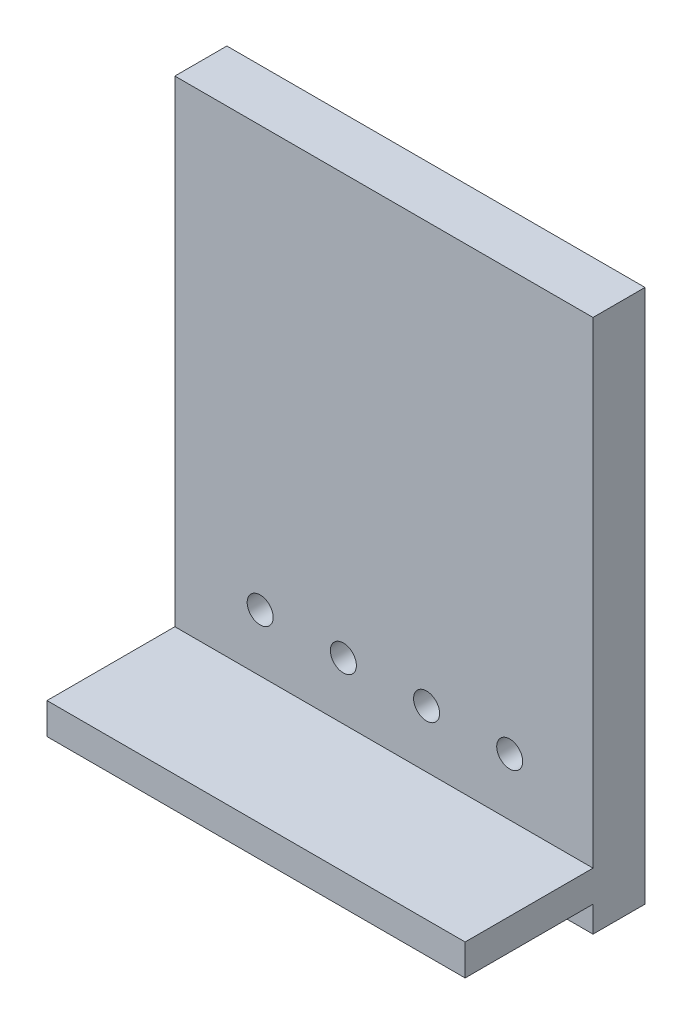
ISO-10303-21;
HEADER;
FILE_DESCRIPTION(('STEP AP214'),'2;1');
FILE_NAME('part.step','',(''),(''),'','','');
FILE_SCHEMA(('AUTOMOTIVE_DESIGN { 1 0 10303 214 1 1 1 1 }'));
ENDSEC;
DATA;
#1=APPLICATION_CONTEXT('core data for automotive mechanical design processes');
#2=APPLICATION_PROTOCOL_DEFINITION('international standard','automotive_design',2000,#1);
#3=PRODUCT_CONTEXT('',#1,'mechanical');
#4=PRODUCT('Part','Part','',(#3));
#5=PRODUCT_RELATED_PRODUCT_CATEGORY('part','',(#4));
#6=PRODUCT_DEFINITION_FORMATION('','',#4);
#7=PRODUCT_DEFINITION_CONTEXT('part definition',#1,'design');
#8=PRODUCT_DEFINITION('design','',#6,#7);
#9=PRODUCT_DEFINITION_SHAPE('','',#8);
#10=(LENGTH_UNIT() NAMED_UNIT(*) SI_UNIT(.MILLI.,.METRE.));
#11=(NAMED_UNIT(*) PLANE_ANGLE_UNIT() SI_UNIT($,.RADIAN.));
#12=(NAMED_UNIT(*) SI_UNIT($,.STERADIAN.) SOLID_ANGLE_UNIT());
#13=UNCERTAINTY_MEASURE_WITH_UNIT(LENGTH_MEASURE(1.E-05),#10,'distance_accuracy_value','');
#14=(GEOMETRIC_REPRESENTATION_CONTEXT(3) GLOBAL_UNCERTAINTY_ASSIGNED_CONTEXT((#13)) GLOBAL_UNIT_ASSIGNED_CONTEXT((#10,
#11,#12)) REPRESENTATION_CONTEXT('',''));
#15=CARTESIAN_POINT('',(0.,0.,0.));
#16=DIRECTION('',(0.,0.,1.));
#17=DIRECTION('',(1.,0.,0.));
#18=AXIS2_PLACEMENT_3D('',#15,#16,#17);
#19=CARTESIAN_POINT('',(0.,0.,5.));
#20=DIRECTION('',(0.,0.,1.));
#21=DIRECTION('',(1.,0.,0.));
#22=AXIS2_PLACEMENT_3D('',#19,#20,#21);
#23=PLANE('',#22);
#24=DIRECTION('',(1.,0.,0.));
#25=VECTOR('',#24,1.);
#26=CARTESIAN_POINT('',(0.,-1284.53054294,5.));
#27=LINE('',#26,#25);
#28=CARTESIAN_POINT('',(-53.4568763637691,-1284.53054294,5.));
#29=VERTEX_POINT('',#28);
#30=CARTESIAN_POINT('',(-13.256876363769,-1284.53054294,5.));
#31=VERTEX_POINT('',#30);
#32=EDGE_CURVE('E121',#29,#31,#27,.T.);
#33=ORIENTED_EDGE('',*,*,#32,.F.);
#34=DIRECTION('',(0.,-1.,0.));
#35=VECTOR('',#34,1.);
#36=CARTESIAN_POINT('',(-53.4568763637691,-1235.68054294037,5.));
#37=LINE('',#36,#35);
#38=CARTESIAN_POINT('',(-53.4568763637691,-1287.03054294037,5.));
#39=VERTEX_POINT('',#38);
#40=EDGE_CURVE('E138',#29,#39,#37,.T.);
#41=ORIENTED_EDGE('',*,*,#40,.T.);
#42=DIRECTION('',(1.,0.,0.));
#43=VECTOR('',#42,1.);
#44=CARTESIAN_POINT('',(-53.4568763637691,-1287.03054294037,5.));
#45=LINE('',#44,#43);
#46=CARTESIAN_POINT('',(-13.256876363769,-1287.03054294037,5.));
#47=VERTEX_POINT('',#46);
#48=EDGE_CURVE('E137',#39,#47,#45,.T.);
#49=ORIENTED_EDGE('',*,*,#48,.T.);
#50=DIRECTION('',(0.,-1.,0.));
#51=VECTOR('',#50,1.);
#52=CARTESIAN_POINT('',(-13.2568763637691,-1235.68054294037,5.));
#53=LINE('',#52,#51);
#54=EDGE_CURVE('E51',#31,#47,#53,.T.);
#55=ORIENTED_EDGE('',*,*,#54,.F.);
#56=EDGE_LOOP('',(#33,#41,#49,#55));
#57=FACE_BOUND('',#56,.T.);
#58=ADVANCED_FACE('F34',(#57),#23,.T.);
#59=CARTESIAN_POINT('',(-53.4568763637691,-1235.68054294037,5.));
#60=DIRECTION('',(1.,0.,0.));
#61=DIRECTION('',(0.,1.,0.));
#62=AXIS2_PLACEMENT_3D('',#59,#60,#61);
#63=PLANE('',#62);
#64=DIRECTION('',(0.,-1.,0.));
#65=VECTOR('',#64,1.);
#66=CARTESIAN_POINT('',(-53.4568763637691,-1235.68054294037,0.));
#67=LINE('',#66,#65);
#68=CARTESIAN_POINT('',(-53.4568763637691,-1235.68054294037,0.));
#69=VERTEX_POINT('',#68);
#70=CARTESIAN_POINT('',(-53.4568763637691,-1287.03054294037,0.));
#71=VERTEX_POINT('',#70);
#72=EDGE_CURVE('E126',#69,#71,#67,.T.);
#73=ORIENTED_EDGE('',*,*,#72,.T.);
#74=DIRECTION('',(0.,0.,-1.));
#75=VECTOR('',#74,1.);
#76=CARTESIAN_POINT('',(-53.4568763637691,-1287.03054294037,5.));
#77=LINE('',#76,#75);
#78=EDGE_CURVE('E11',#39,#71,#77,.T.);
#79=ORIENTED_EDGE('',*,*,#78,.F.);
#80=ORIENTED_EDGE('',*,*,#40,.F.);
#81=DIRECTION('',(0.,0.,-1.));
#82=VECTOR('',#81,1.);
#83=CARTESIAN_POINT('',(-53.4568763637691,-1284.53054294,17.295));
#84=LINE('',#83,#82);
#85=CARTESIAN_POINT('',(-53.4568763637691,-1284.53054294,17.295));
#86=VERTEX_POINT('',#85);
#87=EDGE_CURVE('E131',#86,#29,#84,.T.);
#88=ORIENTED_EDGE('',*,*,#87,.F.);
#89=DIRECTION('',(0.,-1.,0.));
#90=VECTOR('',#89,1.);
#91=CARTESIAN_POINT('',(-53.4568763637694,0.,17.295));
#92=LINE('',#91,#90);
#93=CARTESIAN_POINT('',(-53.4568763637691,-1281.53054294037,17.295));
#94=VERTEX_POINT('',#93);
#95=EDGE_CURVE('E111',#94,#86,#92,.T.);
#96=ORIENTED_EDGE('',*,*,#95,.F.);
#97=DIRECTION('',(0.,0.,-1.));
#98=VECTOR('',#97,1.);
#99=CARTESIAN_POINT('',(-53.4568763637691,-1281.53054294037,17.295));
#100=LINE('',#99,#98);
#101=CARTESIAN_POINT('',(-53.4568763637691,-1281.53054294037,5.));
#102=VERTEX_POINT('',#101);
#103=EDGE_CURVE('E108',#94,#102,#100,.T.);
#104=ORIENTED_EDGE('',*,*,#103,.T.);
#105=CARTESIAN_POINT('',(-53.4568763637691,-1235.68054294037,5.));
#106=VERTEX_POINT('',#105);
#107=EDGE_CURVE('E135',#106,#102,#37,.T.);
#108=ORIENTED_EDGE('',*,*,#107,.F.);
#109=DIRECTION('',(0.,0.,-1.));
#110=VECTOR('',#109,1.);
#111=CARTESIAN_POINT('',(-53.4568763637691,-1235.68054294037,5.));
#112=LINE('',#111,#110);
#113=EDGE_CURVE('E143',#106,#69,#112,.T.);
#114=ORIENTED_EDGE('',*,*,#113,.T.);
#115=EDGE_LOOP('',(#73,#79,#80,#88,#96,#104,#108,#114));
#116=FACE_BOUND('',#115,.T.);
#117=ADVANCED_FACE('F36',(#116),#63,.F.);
#118=CARTESIAN_POINT('',(-53.4568763637691,-1287.03054294037,5.));
#119=DIRECTION('',(0.,1.,0.));
#120=DIRECTION('',(0.,0.,1.));
#121=AXIS2_PLACEMENT_3D('',#118,#119,#120);
#122=PLANE('',#121);
#123=DIRECTION('',(1.,0.,0.));
#124=VECTOR('',#123,1.);
#125=CARTESIAN_POINT('',(-53.4568763637691,-1287.03054294037,0.));
#126=LINE('',#125,#124);
#127=CARTESIAN_POINT('',(-13.256876363769,-1287.03054294037,0.));
#128=VERTEX_POINT('',#127);
#129=EDGE_CURVE('E129',#71,#128,#126,.T.);
#130=ORIENTED_EDGE('',*,*,#129,.T.);
#131=DIRECTION('',(0.,0.,-1.));
#132=VECTOR('',#131,1.);
#133=CARTESIAN_POINT('',(-13.256876363769,-1287.03054294037,5.));
#134=LINE('',#133,#132);
#135=EDGE_CURVE('E43',#47,#128,#134,.T.);
#136=ORIENTED_EDGE('',*,*,#135,.F.);
#137=ORIENTED_EDGE('',*,*,#48,.F.);
#138=ORIENTED_EDGE('',*,*,#78,.T.);
#139=EDGE_LOOP('',(#130,#136,#137,#138));
#140=FACE_BOUND('',#139,.T.);
#141=ADVANCED_FACE('F194',(#140),#122,.F.);
#142=CARTESIAN_POINT('',(-13.2568763637691,-1235.68054294037,5.));
#143=DIRECTION('',(1.,0.,0.));
#144=DIRECTION('',(0.,1.,0.));
#145=AXIS2_PLACEMENT_3D('',#142,#143,#144);
#146=PLANE('',#145);
#147=DIRECTION('',(0.,-1.,0.));
#148=VECTOR('',#147,1.);
#149=CARTESIAN_POINT('',(-13.2568763637691,-1235.68054294037,0.));
#150=LINE('',#149,#148);
#151=CARTESIAN_POINT('',(-13.2568763637691,-1235.68054294037,0.));
#152=VERTEX_POINT('',#151);
#153=EDGE_CURVE('E147',#152,#128,#150,.T.);
#154=ORIENTED_EDGE('',*,*,#153,.F.);
#155=DIRECTION('',(0.,0.,-1.));
#156=VECTOR('',#155,1.);
#157=CARTESIAN_POINT('',(-13.2568763637691,-1235.68054294037,5.));
#158=LINE('',#157,#156);
#159=CARTESIAN_POINT('',(-13.2568763637691,-1235.68054294037,5.));
#160=VERTEX_POINT('',#159);
#161=EDGE_CURVE('E154',#160,#152,#158,.T.);
#162=ORIENTED_EDGE('',*,*,#161,.F.);
#163=CARTESIAN_POINT('',(-13.256876363769,-1281.53054294037,5.));
#164=VERTEX_POINT('',#163);
#165=EDGE_CURVE('E125',#160,#164,#53,.T.);
#166=ORIENTED_EDGE('',*,*,#165,.T.);
#167=DIRECTION('',(0.,0.,-1.));
#168=VECTOR('',#167,1.);
#169=CARTESIAN_POINT('',(-13.256876363769,-1281.53054294037,17.295));
#170=LINE('',#169,#168);
#171=CARTESIAN_POINT('',(-13.256876363769,-1281.53054294037,17.295));
#172=VERTEX_POINT('',#171);
#173=EDGE_CURVE('E106',#172,#164,#170,.T.);
#174=ORIENTED_EDGE('',*,*,#173,.F.);
#175=DIRECTION('',(0.,1.,0.));
#176=VECTOR('',#175,1.);
#177=CARTESIAN_POINT('',(-13.2568763637692,0.,17.295));
#178=LINE('',#177,#176);
#179=CARTESIAN_POINT('',(-13.256876363769,-1284.53054294,17.295));
#180=VERTEX_POINT('',#179);
#181=EDGE_CURVE('E112',#180,#172,#178,.T.);
#182=ORIENTED_EDGE('',*,*,#181,.F.);
#183=DIRECTION('',(0.,0.,-1.));
#184=VECTOR('',#183,1.);
#185=CARTESIAN_POINT('',(-13.256876363769,-1284.53054294,17.295));
#186=LINE('',#185,#184);
#187=EDGE_CURVE('E181',#180,#31,#186,.T.);
#188=ORIENTED_EDGE('',*,*,#187,.T.);
#189=ORIENTED_EDGE('',*,*,#54,.T.);
#190=ORIENTED_EDGE('',*,*,#135,.T.);
#191=EDGE_LOOP('',(#154,#162,#166,#174,#182,#188,#189,#190));
#192=FACE_BOUND('',#191,.T.);
#193=ADVANCED_FACE('F124',(#192),#146,.T.);
#194=CARTESIAN_POINT('',(-53.4568763637691,-1235.68054294037,5.));
#195=DIRECTION('',(0.,1.,0.));
#196=DIRECTION('',(0.,0.,1.));
#197=AXIS2_PLACEMENT_3D('',#194,#195,#196);
#198=PLANE('',#197);
#199=DIRECTION('',(1.,0.,0.));
#200=VECTOR('',#199,1.);
#201=CARTESIAN_POINT('',(-53.4568763637691,-1235.68054294037,0.));
#202=LINE('',#201,#200);
#203=EDGE_CURVE('E150',#69,#152,#202,.T.);
#204=ORIENTED_EDGE('',*,*,#203,.F.);
#205=ORIENTED_EDGE('',*,*,#113,.F.);
#206=DIRECTION('',(1.,0.,0.));
#207=VECTOR('',#206,1.);
#208=CARTESIAN_POINT('',(-53.4568763637691,-1235.68054294037,5.));
#209=LINE('',#208,#207);
#210=EDGE_CURVE('E141',#106,#160,#209,.T.);
#211=ORIENTED_EDGE('',*,*,#210,.T.);
#212=ORIENTED_EDGE('',*,*,#161,.T.);
#213=EDGE_LOOP('',(#204,#205,#211,#212));
#214=FACE_BOUND('',#213,.T.);
#215=ADVANCED_FACE('F200',(#214),#198,.T.);
#216=CARTESIAN_POINT('',(-37.256876363755,-1276.03054292522,5.));
#217=DIRECTION('',(0.,0.,1.));
#218=DIRECTION('',(1.,0.,0.));
#219=AXIS2_PLACEMENT_3D('',#216,#217,#218);
#220=CIRCLE('',#219,1.24999999409263);
#221=CARTESIAN_POINT('',(-36.0068763696624,-1276.03054292522,5.));
#222=VERTEX_POINT('',#221);
#223=EDGE_CURVE('E164',#222,#222,#220,.T.);
#224=ORIENTED_EDGE('',*,*,#223,.F.);
#225=EDGE_LOOP('',(#224));
#226=FACE_BOUND('',#225,.T.);
#227=CARTESIAN_POINT('',(-29.256876363755,-1276.03054293027,5.));
#228=DIRECTION('',(0.,0.,1.));
#229=DIRECTION('',(1.,0.,0.));
#230=AXIS2_PLACEMENT_3D('',#227,#228,#229);
#231=CIRCLE('',#230,1.24999999555632);
#232=CARTESIAN_POINT('',(-28.0068763681987,-1276.03054293027,5.));
#233=VERTEX_POINT('',#232);
#234=EDGE_CURVE('E333',#233,#233,#231,.T.);
#235=ORIENTED_EDGE('',*,*,#234,.F.);
#236=EDGE_LOOP('',(#235));
#237=FACE_BOUND('',#236,.T.);
#238=CARTESIAN_POINT('',(-21.2648556699468,-1276.03054293027,5.));
#239=DIRECTION('',(0.,0.,1.));
#240=DIRECTION('',(1.,0.,0.));
#241=AXIS2_PLACEMENT_3D('',#238,#239,#240);
#242=CIRCLE('',#241,1.24999999555632);
#243=CARTESIAN_POINT('',(-20.0148556743905,-1276.03054293027,5.));
#244=VERTEX_POINT('',#243);
#245=EDGE_CURVE('E176',#244,#244,#242,.T.);
#246=ORIENTED_EDGE('',*,*,#245,.F.);
#247=EDGE_LOOP('',(#246));
#248=FACE_BOUND('',#247,.T.);
#249=CARTESIAN_POINT('',(-45.256876363755,-1276.03054292522,5.));
#250=DIRECTION('',(0.,0.,1.));
#251=DIRECTION('',(1.,0.,0.));
#252=AXIS2_PLACEMENT_3D('',#249,#250,#251);
#253=CIRCLE('',#252,1.2499999955696);
#254=CARTESIAN_POINT('',(-44.0068763681854,-1276.03054292522,5.));
#255=VERTEX_POINT('',#254);
#256=EDGE_CURVE('E160',#255,#255,#253,.T.);
#257=ORIENTED_EDGE('',*,*,#256,.F.);
#258=EDGE_LOOP('',(#257));
#259=FACE_BOUND('',#258,.T.);
#260=DIRECTION('',(-1.,0.,0.));
#261=VECTOR('',#260,1.);
#262=CARTESIAN_POINT('',(0.,-1281.53054294037,5.));
#263=LINE('',#262,#261);
#264=EDGE_CURVE('E59',#164,#102,#263,.T.);
#265=ORIENTED_EDGE('',*,*,#264,.F.);
#266=ORIENTED_EDGE('',*,*,#165,.F.);
#267=ORIENTED_EDGE('',*,*,#210,.F.);
#268=ORIENTED_EDGE('',*,*,#107,.T.);
#269=EDGE_LOOP('',(#265,#266,#267,#268));
#270=FACE_BOUND('',#269,.T.);
#271=ADVANCED_FACE('F203',(#226,#237,#248,#259,#270),#23,.T.);
#272=CARTESIAN_POINT('',(0.,0.,0.));
#273=DIRECTION('',(0.,0.,1.));
#274=DIRECTION('',(1.,0.,0.));
#275=AXIS2_PLACEMENT_3D('',#272,#273,#274);
#276=PLANE('',#275);
#277=CARTESIAN_POINT('',(-37.256876363755,-1276.03054292522,0.));
#278=DIRECTION('',(0.,0.,1.));
#279=DIRECTION('',(1.,0.,0.));
#280=AXIS2_PLACEMENT_3D('',#277,#278,#279);
#281=CIRCLE('',#280,1.24999999409263);
#282=CARTESIAN_POINT('',(-36.0068763696624,-1276.03054292522,0.));
#283=VERTEX_POINT('',#282);
#284=EDGE_CURVE('E38',#283,#283,#281,.T.);
#285=ORIENTED_EDGE('',*,*,#284,.T.);
#286=EDGE_LOOP('',(#285));
#287=FACE_BOUND('',#286,.T.);
#288=CARTESIAN_POINT('',(-29.256876363755,-1276.03054293027,0.));
#289=DIRECTION('',(0.,0.,1.));
#290=DIRECTION('',(1.,0.,0.));
#291=AXIS2_PLACEMENT_3D('',#288,#289,#290);
#292=CIRCLE('',#291,1.24999999555632);
#293=CARTESIAN_POINT('',(-28.0068763681987,-1276.03054293027,0.));
#294=VERTEX_POINT('',#293);
#295=EDGE_CURVE('E163',#294,#294,#292,.T.);
#296=ORIENTED_EDGE('',*,*,#295,.T.);
#297=EDGE_LOOP('',(#296));
#298=FACE_BOUND('',#297,.T.);
#299=CARTESIAN_POINT('',(-21.2648556699468,-1276.03054293027,0.));
#300=DIRECTION('',(0.,0.,1.));
#301=DIRECTION('',(1.,0.,0.));
#302=AXIS2_PLACEMENT_3D('',#299,#300,#301);
#303=CIRCLE('',#302,1.24999999555632);
#304=CARTESIAN_POINT('',(-20.0148556743905,-1276.03054293027,0.));
#305=VERTEX_POINT('',#304);
#306=EDGE_CURVE('E161',#305,#305,#303,.T.);
#307=ORIENTED_EDGE('',*,*,#306,.T.);
#308=EDGE_LOOP('',(#307));
#309=FACE_BOUND('',#308,.T.);
#310=CARTESIAN_POINT('',(-45.256876363755,-1276.03054292522,0.));
#311=DIRECTION('',(0.,0.,1.));
#312=DIRECTION('',(1.,0.,0.));
#313=AXIS2_PLACEMENT_3D('',#310,#311,#312);
#314=CIRCLE('',#313,1.2499999955696);
#315=CARTESIAN_POINT('',(-44.0068763681854,-1276.03054292522,0.));
#316=VERTEX_POINT('',#315);
#317=EDGE_CURVE('E157',#316,#316,#314,.T.);
#318=ORIENTED_EDGE('',*,*,#317,.T.);
#319=EDGE_LOOP('',(#318));
#320=FACE_BOUND('',#319,.T.);
#321=ORIENTED_EDGE('',*,*,#72,.F.);
#322=ORIENTED_EDGE('',*,*,#203,.T.);
#323=ORIENTED_EDGE('',*,*,#153,.T.);
#324=ORIENTED_EDGE('',*,*,#129,.F.);
#325=EDGE_LOOP('',(#321,#322,#323,#324));
#326=FACE_BOUND('',#325,.T.);
#327=ADVANCED_FACE('F198',(#287,#298,#309,#320,#326),#276,.F.);
#328=CARTESIAN_POINT('',(0.,-1281.53054294037,17.295));
#329=DIRECTION('',(0.,-1.,0.));
#330=DIRECTION('',(0.,0.,-1.));
#331=AXIS2_PLACEMENT_3D('',#328,#329,#330);
#332=PLANE('',#331);
#333=ORIENTED_EDGE('',*,*,#264,.T.);
#334=ORIENTED_EDGE('',*,*,#103,.F.);
#335=DIRECTION('',(-1.,0.,0.));
#336=VECTOR('',#335,1.);
#337=CARTESIAN_POINT('',(0.,-1281.53054294037,17.295));
#338=LINE('',#337,#336);
#339=EDGE_CURVE('E102',#172,#94,#338,.T.);
#340=ORIENTED_EDGE('',*,*,#339,.F.);
#341=ORIENTED_EDGE('',*,*,#173,.T.);
#342=EDGE_LOOP('',(#333,#334,#340,#341));
#343=FACE_BOUND('',#342,.T.);
#344=ADVANCED_FACE('F104',(#343),#332,.F.);
#345=CARTESIAN_POINT('',(0.,-1284.53054294,17.295));
#346=DIRECTION('',(0.,1.,0.));
#347=DIRECTION('',(0.,0.,1.));
#348=AXIS2_PLACEMENT_3D('',#345,#346,#347);
#349=PLANE('',#348);
#350=ORIENTED_EDGE('',*,*,#32,.T.);
#351=ORIENTED_EDGE('',*,*,#187,.F.);
#352=DIRECTION('',(1.,0.,0.));
#353=VECTOR('',#352,1.);
#354=CARTESIAN_POINT('',(0.,-1284.53054294,17.295));
#355=LINE('',#354,#353);
#356=EDGE_CURVE('E117',#86,#180,#355,.T.);
#357=ORIENTED_EDGE('',*,*,#356,.F.);
#358=ORIENTED_EDGE('',*,*,#87,.T.);
#359=EDGE_LOOP('',(#350,#351,#357,#358));
#360=FACE_BOUND('',#359,.T.);
#361=ADVANCED_FACE('F187',(#360),#349,.F.);
#362=CARTESIAN_POINT('',(0.,0.,17.295));
#363=DIRECTION('',(0.,0.,1.));
#364=DIRECTION('',(1.,0.,0.));
#365=AXIS2_PLACEMENT_3D('',#362,#363,#364);
#366=PLANE('',#365);
#367=ORIENTED_EDGE('',*,*,#181,.T.);
#368=ORIENTED_EDGE('',*,*,#339,.T.);
#369=ORIENTED_EDGE('',*,*,#95,.T.);
#370=ORIENTED_EDGE('',*,*,#356,.T.);
#371=EDGE_LOOP('',(#367,#368,#369,#370));
#372=FACE_BOUND('',#371,.T.);
#373=ADVANCED_FACE('F115',(#372),#366,.T.);
#374=CARTESIAN_POINT('',(-45.256876363755,-1276.03054292522,-5.));
#375=DIRECTION('',(0.,0.,1.));
#376=DIRECTION('',(1.,0.,0.));
#377=AXIS2_PLACEMENT_3D('',#374,#375,#376);
#378=CYLINDRICAL_SURFACE('',#377,1.2499999955696);
#379=ORIENTED_EDGE('',*,*,#256,.T.);
#380=EDGE_LOOP('',(#379));
#381=FACE_BOUND('',#380,.T.);
#382=ORIENTED_EDGE('',*,*,#317,.F.);
#383=EDGE_LOOP('',(#382));
#384=FACE_BOUND('',#383,.T.);
#385=ADVANCED_FACE('F280',(#381,#384),#378,.F.);
#386=CARTESIAN_POINT('',(-21.2648556699468,-1276.03054293027,-5.));
#387=DIRECTION('',(0.,0.,1.));
#388=DIRECTION('',(1.,0.,0.));
#389=AXIS2_PLACEMENT_3D('',#386,#387,#388);
#390=CYLINDRICAL_SURFACE('',#389,1.24999999555632);
#391=ORIENTED_EDGE('',*,*,#245,.T.);
#392=EDGE_LOOP('',(#391));
#393=FACE_BOUND('',#392,.T.);
#394=ORIENTED_EDGE('',*,*,#306,.F.);
#395=EDGE_LOOP('',(#394));
#396=FACE_BOUND('',#395,.T.);
#397=ADVANCED_FACE('F288',(#393,#396),#390,.F.);
#398=CARTESIAN_POINT('',(-29.256876363755,-1276.03054293027,-5.));
#399=DIRECTION('',(0.,0.,1.));
#400=DIRECTION('',(1.,0.,0.));
#401=AXIS2_PLACEMENT_3D('',#398,#399,#400);
#402=CYLINDRICAL_SURFACE('',#401,1.24999999555632);
#403=ORIENTED_EDGE('',*,*,#234,.T.);
#404=EDGE_LOOP('',(#403));
#405=FACE_BOUND('',#404,.T.);
#406=ORIENTED_EDGE('',*,*,#295,.F.);
#407=EDGE_LOOP('',(#406));
#408=FACE_BOUND('',#407,.T.);
#409=ADVANCED_FACE('F297',(#405,#408),#402,.F.);
#410=CARTESIAN_POINT('',(-37.256876363755,-1276.03054292522,-5.));
#411=DIRECTION('',(0.,0.,1.));
#412=DIRECTION('',(1.,0.,0.));
#413=AXIS2_PLACEMENT_3D('',#410,#411,#412);
#414=CYLINDRICAL_SURFACE('',#413,1.24999999409263);
#415=ORIENTED_EDGE('',*,*,#223,.T.);
#416=EDGE_LOOP('',(#415));
#417=FACE_BOUND('',#416,.T.);
#418=ORIENTED_EDGE('',*,*,#284,.F.);
#419=EDGE_LOOP('',(#418));
#420=FACE_BOUND('',#419,.T.);
#421=ADVANCED_FACE('F306',(#417,#420),#414,.F.);
#422=CLOSED_SHELL('',(#58,#117,#141,#193,#215,#271,#327,#344,#361,#373,#385,#397,#409,#421));
#423=MANIFOLD_SOLID_BREP('B2',#422);
#424=ADVANCED_BREP_SHAPE_REPRESENTATION('',(#18,#423),#14);
#425=SHAPE_DEFINITION_REPRESENTATION(#9,#424);
ENDSEC;
END-ISO-10303-21;
